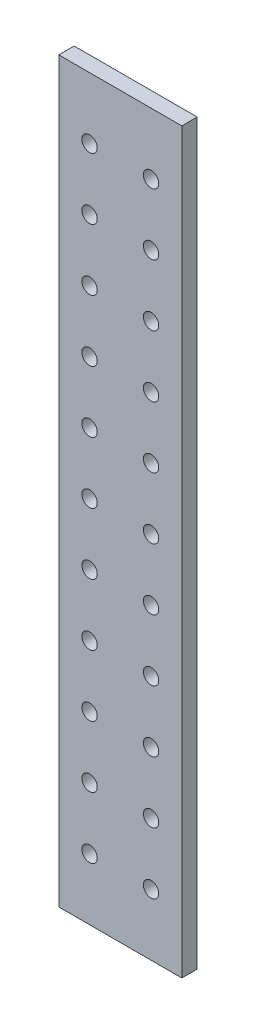
ISO-10303-21;
HEADER;
FILE_DESCRIPTION(('STEP AP214'),'2;1');
FILE_NAME('part.step','',(''),(''),'','','');
FILE_SCHEMA(('AUTOMOTIVE_DESIGN { 1 0 10303 214 1 1 1 1 }'));
ENDSEC;
DATA;
#1=APPLICATION_CONTEXT('core data for automotive mechanical design processes');
#2=APPLICATION_PROTOCOL_DEFINITION('international standard','automotive_design',2000,#1);
#3=PRODUCT_CONTEXT('',#1,'mechanical');
#4=PRODUCT('Part','Part','',(#3));
#5=PRODUCT_RELATED_PRODUCT_CATEGORY('part','',(#4));
#6=PRODUCT_DEFINITION_FORMATION('','',#4);
#7=PRODUCT_DEFINITION_CONTEXT('part definition',#1,'design');
#8=PRODUCT_DEFINITION('design','',#6,#7);
#9=PRODUCT_DEFINITION_SHAPE('','',#8);
#10=(LENGTH_UNIT() NAMED_UNIT(*) SI_UNIT(.MILLI.,.METRE.));
#11=(NAMED_UNIT(*) PLANE_ANGLE_UNIT() SI_UNIT($,.RADIAN.));
#12=(NAMED_UNIT(*) SI_UNIT($,.STERADIAN.) SOLID_ANGLE_UNIT());
#13=UNCERTAINTY_MEASURE_WITH_UNIT(LENGTH_MEASURE(1.E-05),#10,'distance_accuracy_value','');
#14=(GEOMETRIC_REPRESENTATION_CONTEXT(3) GLOBAL_UNCERTAINTY_ASSIGNED_CONTEXT((#13)) GLOBAL_UNIT_ASSIGNED_CONTEXT((#10,
#11,#12)) REPRESENTATION_CONTEXT('',''));
#15=CARTESIAN_POINT('',(0.,0.,0.));
#16=DIRECTION('',(0.,0.,1.));
#17=DIRECTION('',(1.,0.,0.));
#18=AXIS2_PLACEMENT_3D('',#15,#16,#17);
#19=CARTESIAN_POINT('',(25.4,152.4,3.175));
#20=DIRECTION('',(-1.,0.,0.));
#21=DIRECTION('',(0.,-1.,0.));
#22=AXIS2_PLACEMENT_3D('',#19,#20,#21);
#23=PLANE('',#22);
#24=DIRECTION('',(0.,1.,0.));
#25=VECTOR('',#24,1.);
#26=CARTESIAN_POINT('',(25.4,152.4,-3.175));
#27=LINE('',#26,#25);
#28=CARTESIAN_POINT('',(25.4,-152.4,-3.175));
#29=VERTEX_POINT('',#28);
#30=CARTESIAN_POINT('',(25.4,152.4,-3.175));
#31=VERTEX_POINT('',#30);
#32=EDGE_CURVE('E95',#29,#31,#27,.T.);
#33=ORIENTED_EDGE('',*,*,#32,.T.);
#34=DIRECTION('',(0.,0.,-1.));
#35=VECTOR('',#34,1.);
#36=CARTESIAN_POINT('',(25.4,152.4,3.175));
#37=LINE('',#36,#35);
#38=CARTESIAN_POINT('',(25.4,152.4,3.175));
#39=VERTEX_POINT('',#38);
#40=EDGE_CURVE('E11',#39,#31,#37,.T.);
#41=ORIENTED_EDGE('',*,*,#40,.F.);
#42=DIRECTION('',(0.,1.,0.));
#43=VECTOR('',#42,1.);
#44=CARTESIAN_POINT('',(25.4,152.4,3.175));
#45=LINE('',#44,#43);
#46=CARTESIAN_POINT('',(25.4,-152.4,3.175));
#47=VERTEX_POINT('',#46);
#48=EDGE_CURVE('E83',#47,#39,#45,.T.);
#49=ORIENTED_EDGE('',*,*,#48,.F.);
#50=DIRECTION('',(0.,0.,-1.));
#51=VECTOR('',#50,1.);
#52=CARTESIAN_POINT('',(25.4,-152.4,3.175));
#53=LINE('',#52,#51);
#54=EDGE_CURVE('E91',#47,#29,#53,.T.);
#55=ORIENTED_EDGE('',*,*,#54,.T.);
#56=EDGE_LOOP('',(#33,#41,#49,#55));
#57=FACE_BOUND('',#56,.T.);
#58=ADVANCED_FACE('F32',(#57),#23,.F.);
#59=CARTESIAN_POINT('',(-25.4,152.4,3.175));
#60=DIRECTION('',(0.,-1.,0.));
#61=DIRECTION('',(0.,0.,-1.));
#62=AXIS2_PLACEMENT_3D('',#59,#60,#61);
#63=PLANE('',#62);
#64=DIRECTION('',(-1.,0.,0.));
#65=VECTOR('',#64,1.);
#66=CARTESIAN_POINT('',(-25.4,152.4,-3.175));
#67=LINE('',#66,#65);
#68=CARTESIAN_POINT('',(-25.4,152.4,-3.175));
#69=VERTEX_POINT('',#68);
#70=EDGE_CURVE('E87',#31,#69,#67,.T.);
#71=ORIENTED_EDGE('',*,*,#70,.T.);
#72=DIRECTION('',(0.,0.,-1.));
#73=VECTOR('',#72,1.);
#74=CARTESIAN_POINT('',(-25.4,152.4,3.175));
#75=LINE('',#74,#73);
#76=CARTESIAN_POINT('',(-25.4,152.4,3.175));
#77=VERTEX_POINT('',#76);
#78=EDGE_CURVE('E40',#77,#69,#75,.T.);
#79=ORIENTED_EDGE('',*,*,#78,.F.);
#80=DIRECTION('',(-1.,0.,0.));
#81=VECTOR('',#80,1.);
#82=CARTESIAN_POINT('',(-25.4,152.4,3.175));
#83=LINE('',#82,#81);
#84=EDGE_CURVE('E78',#39,#77,#83,.T.);
#85=ORIENTED_EDGE('',*,*,#84,.F.);
#86=ORIENTED_EDGE('',*,*,#40,.T.);
#87=EDGE_LOOP('',(#71,#79,#85,#86));
#88=FACE_BOUND('',#87,.T.);
#89=ADVANCED_FACE('F86',(#88),#63,.F.);
#90=CARTESIAN_POINT('',(-25.4,152.4,3.175));
#91=DIRECTION('',(1.,0.,0.));
#92=DIRECTION('',(0.,1.,0.));
#93=AXIS2_PLACEMENT_3D('',#90,#91,#92);
#94=PLANE('',#93);
#95=DIRECTION('',(0.,-1.,0.));
#96=VECTOR('',#95,1.);
#97=CARTESIAN_POINT('',(-25.4,152.4,-3.175));
#98=LINE('',#97,#96);
#99=CARTESIAN_POINT('',(-25.4,-152.4,-3.175));
#100=VERTEX_POINT('',#99);
#101=EDGE_CURVE('E65',#69,#100,#98,.T.);
#102=ORIENTED_EDGE('',*,*,#101,.T.);
#103=DIRECTION('',(0.,0.,-1.));
#104=VECTOR('',#103,1.);
#105=CARTESIAN_POINT('',(-25.4,-152.4,3.175));
#106=LINE('',#105,#104);
#107=CARTESIAN_POINT('',(-25.4,-152.4,3.175));
#108=VERTEX_POINT('',#107);
#109=EDGE_CURVE('E88',#108,#100,#106,.T.);
#110=ORIENTED_EDGE('',*,*,#109,.F.);
#111=DIRECTION('',(0.,-1.,0.));
#112=VECTOR('',#111,1.);
#113=CARTESIAN_POINT('',(-25.4,152.4,3.175));
#114=LINE('',#113,#112);
#115=EDGE_CURVE('E81',#77,#108,#114,.T.);
#116=ORIENTED_EDGE('',*,*,#115,.F.);
#117=ORIENTED_EDGE('',*,*,#78,.T.);
#118=EDGE_LOOP('',(#102,#110,#116,#117));
#119=FACE_BOUND('',#118,.T.);
#120=ADVANCED_FACE('F89',(#119),#94,.F.);
#121=CARTESIAN_POINT('',(-25.4,-152.4,3.175));
#122=DIRECTION('',(0.,1.,0.));
#123=DIRECTION('',(0.,0.,1.));
#124=AXIS2_PLACEMENT_3D('',#121,#122,#123);
#125=PLANE('',#124);
#126=DIRECTION('',(1.,0.,0.));
#127=VECTOR('',#126,1.);
#128=CARTESIAN_POINT('',(-25.4,-152.4,-3.175));
#129=LINE('',#128,#127);
#130=EDGE_CURVE('E71',#100,#29,#129,.T.);
#131=ORIENTED_EDGE('',*,*,#130,.T.);
#132=ORIENTED_EDGE('',*,*,#54,.F.);
#133=DIRECTION('',(1.,0.,0.));
#134=VECTOR('',#133,1.);
#135=CARTESIAN_POINT('',(-25.4,-152.4,3.175));
#136=LINE('',#135,#134);
#137=EDGE_CURVE('E48',#108,#47,#136,.T.);
#138=ORIENTED_EDGE('',*,*,#137,.F.);
#139=ORIENTED_EDGE('',*,*,#109,.T.);
#140=EDGE_LOOP('',(#131,#132,#138,#139));
#141=FACE_BOUND('',#140,.T.);
#142=ADVANCED_FACE('F103',(#141),#125,.F.);
#143=CARTESIAN_POINT('',(0.,0.,3.175));
#144=DIRECTION('',(0.,0.,1.));
#145=DIRECTION('',(1.,0.,0.));
#146=AXIS2_PLACEMENT_3D('',#143,#144,#145);
#147=PLANE('',#146);
#148=CARTESIAN_POINT('',(-12.6999999999989,25.4000000000001,3.175));
#149=DIRECTION('',(0.,0.,1.));
#150=DIRECTION('',(1.,0.,0.));
#151=AXIS2_PLACEMENT_3D('',#148,#149,#150);
#152=CIRCLE('',#151,3.175);
#153=CARTESIAN_POINT('',(-9.52499999999894,25.4000000000001,3.175));
#154=VERTEX_POINT('',#153);
#155=EDGE_CURVE('E191',#154,#154,#152,.T.);
#156=ORIENTED_EDGE('',*,*,#155,.F.);
#157=EDGE_LOOP('',(#156));
#158=FACE_BOUND('',#157,.T.);
#159=CARTESIAN_POINT('',(-12.6999999999992,50.8000000000001,3.175));
#160=DIRECTION('',(0.,0.,1.));
#161=DIRECTION('',(1.,0.,0.));
#162=AXIS2_PLACEMENT_3D('',#159,#160,#161);
#163=CIRCLE('',#162,3.175);
#164=CARTESIAN_POINT('',(-9.52499999999922,50.8000000000001,3.175));
#165=VERTEX_POINT('',#164);
#166=EDGE_CURVE('E190',#165,#165,#163,.T.);
#167=ORIENTED_EDGE('',*,*,#166,.F.);
#168=EDGE_LOOP('',(#167));
#169=FACE_BOUND('',#168,.T.);
#170=CARTESIAN_POINT('',(-12.6999999999995,76.2000000000001,3.175));
#171=DIRECTION('',(0.,0.,1.));
#172=DIRECTION('',(1.,0.,0.));
#173=AXIS2_PLACEMENT_3D('',#170,#171,#172);
#174=CIRCLE('',#173,3.175);
#175=CARTESIAN_POINT('',(-9.52499999999949,76.2000000000001,3.175));
#176=VERTEX_POINT('',#175);
#177=EDGE_CURVE('E198',#176,#176,#174,.T.);
#178=ORIENTED_EDGE('',*,*,#177,.F.);
#179=EDGE_LOOP('',(#178));
#180=FACE_BOUND('',#179,.T.);
#181=CARTESIAN_POINT('',(-12.6999999999997,101.6,3.175));
#182=DIRECTION('',(0.,0.,1.));
#183=DIRECTION('',(1.,0.,0.));
#184=AXIS2_PLACEMENT_3D('',#181,#182,#183);
#185=CIRCLE('',#184,3.175);
#186=CARTESIAN_POINT('',(-9.52499999999975,101.6,3.175));
#187=VERTEX_POINT('',#186);
#188=EDGE_CURVE('E179',#187,#187,#185,.T.);
#189=ORIENTED_EDGE('',*,*,#188,.F.);
#190=EDGE_LOOP('',(#189));
#191=FACE_BOUND('',#190,.T.);
#192=CARTESIAN_POINT('',(12.7000000000024,-101.599999999999,3.175));
#193=DIRECTION('',(0.,0.,1.));
#194=DIRECTION('',(1.,0.,0.));
#195=AXIS2_PLACEMENT_3D('',#192,#193,#194);
#196=CIRCLE('',#195,3.175);
#197=CARTESIAN_POINT('',(15.8750000000024,-101.599999999999,3.175));
#198=VERTEX_POINT('',#197);
#199=EDGE_CURVE('E178',#198,#198,#196,.T.);
#200=ORIENTED_EDGE('',*,*,#199,.F.);
#201=EDGE_LOOP('',(#200));
#202=FACE_BOUND('',#201,.T.);
#203=CARTESIAN_POINT('',(-12.6999999999987,1.38777878078145E-13,3.175));
#204=DIRECTION('',(0.,0.,1.));
#205=DIRECTION('',(1.,0.,0.));
#206=AXIS2_PLACEMENT_3D('',#203,#204,#205);
#207=CIRCLE('',#206,3.17500000000001);
#208=CARTESIAN_POINT('',(-9.52499999999868,1.38777878078145E-13,3.175));
#209=VERTEX_POINT('',#208);
#210=EDGE_CURVE('E233',#209,#209,#207,.T.);
#211=ORIENTED_EDGE('',*,*,#210,.F.);
#212=EDGE_LOOP('',(#211));
#213=FACE_BOUND('',#212,.T.);
#214=CARTESIAN_POINT('',(-12.6999999999984,-25.3999999999998,3.175));
#215=DIRECTION('',(0.,0.,1.));
#216=DIRECTION('',(1.,0.,0.));
#217=AXIS2_PLACEMENT_3D('',#214,#215,#216);
#218=CIRCLE('',#217,3.175);
#219=CARTESIAN_POINT('',(-9.52499999999841,-25.3999999999998,3.175));
#220=VERTEX_POINT('',#219);
#221=EDGE_CURVE('E227',#220,#220,#218,.T.);
#222=ORIENTED_EDGE('',*,*,#221,.F.);
#223=EDGE_LOOP('',(#222));
#224=FACE_BOUND('',#223,.T.);
#225=CARTESIAN_POINT('',(-12.6999999999982,-50.7999999999998,3.175));
#226=DIRECTION('',(0.,0.,1.));
#227=DIRECTION('',(1.,0.,0.));
#228=AXIS2_PLACEMENT_3D('',#225,#226,#227);
#229=CIRCLE('',#228,3.175);
#230=CARTESIAN_POINT('',(-9.52499999999815,-50.7999999999998,3.175));
#231=VERTEX_POINT('',#230);
#232=EDGE_CURVE('E221',#231,#231,#229,.T.);
#233=ORIENTED_EDGE('',*,*,#232,.F.);
#234=EDGE_LOOP('',(#233));
#235=FACE_BOUND('',#234,.T.);
#236=CARTESIAN_POINT('',(-12.6999999999979,-76.1999999999998,3.175));
#237=DIRECTION('',(0.,0.,1.));
#238=DIRECTION('',(1.,0.,0.));
#239=AXIS2_PLACEMENT_3D('',#236,#237,#238);
#240=CIRCLE('',#239,3.175);
#241=CARTESIAN_POINT('',(-9.52499999999789,-76.1999999999998,3.175));
#242=VERTEX_POINT('',#241);
#243=EDGE_CURVE('E215',#242,#242,#240,.T.);
#244=ORIENTED_EDGE('',*,*,#243,.F.);
#245=EDGE_LOOP('',(#244));
#246=FACE_BOUND('',#245,.T.);
#247=CARTESIAN_POINT('',(-12.6999999999976,-101.6,3.175));
#248=DIRECTION('',(0.,0.,1.));
#249=DIRECTION('',(1.,0.,0.));
#250=AXIS2_PLACEMENT_3D('',#247,#248,#249);
#251=CIRCLE('',#250,3.175);
#252=CARTESIAN_POINT('',(-9.52499999999762,-101.6,3.175));
#253=VERTEX_POINT('',#252);
#254=EDGE_CURVE('E208',#253,#253,#251,.T.);
#255=ORIENTED_EDGE('',*,*,#254,.F.);
#256=EDGE_LOOP('',(#255));
#257=FACE_BOUND('',#256,.T.);
#258=CARTESIAN_POINT('',(12.7000000000026,-126.999999999999,3.175));
#259=DIRECTION('',(0.,0.,1.));
#260=DIRECTION('',(1.,0.,0.));
#261=AXIS2_PLACEMENT_3D('',#258,#259,#260);
#262=CIRCLE('',#261,3.175);
#263=CARTESIAN_POINT('',(15.8750000000026,-126.999999999999,3.175));
#264=VERTEX_POINT('',#263);
#265=EDGE_CURVE('E209',#264,#264,#262,.T.);
#266=ORIENTED_EDGE('',*,*,#265,.F.);
#267=EDGE_LOOP('',(#266));
#268=FACE_BOUND('',#267,.T.);
#269=CARTESIAN_POINT('',(12.7000000000008,50.8000000000005,3.175));
#270=DIRECTION('',(0.,0.,1.));
#271=DIRECTION('',(1.,0.,0.));
#272=AXIS2_PLACEMENT_3D('',#269,#270,#271);
#273=CIRCLE('',#272,3.175);
#274=CARTESIAN_POINT('',(15.8750000000008,50.8000000000005,3.175));
#275=VERTEX_POINT('',#274);
#276=EDGE_CURVE('E131',#275,#275,#273,.T.);
#277=ORIENTED_EDGE('',*,*,#276,.F.);
#278=EDGE_LOOP('',(#277));
#279=FACE_BOUND('',#278,.T.);
#280=CARTESIAN_POINT('',(12.7000000000005,76.2000000000004,3.175));
#281=DIRECTION('',(0.,0.,1.));
#282=DIRECTION('',(1.,0.,0.));
#283=AXIS2_PLACEMENT_3D('',#280,#281,#282);
#284=CIRCLE('',#283,3.175);
#285=CARTESIAN_POINT('',(15.8750000000005,76.2000000000004,3.175));
#286=VERTEX_POINT('',#285);
#287=EDGE_CURVE('E130',#286,#286,#284,.T.);
#288=ORIENTED_EDGE('',*,*,#287,.F.);
#289=EDGE_LOOP('',(#288));
#290=FACE_BOUND('',#289,.T.);
#291=CARTESIAN_POINT('',(12.7000000000003,101.6,3.175));
#292=DIRECTION('',(0.,0.,1.));
#293=DIRECTION('',(1.,0.,0.));
#294=AXIS2_PLACEMENT_3D('',#291,#292,#293);
#295=CIRCLE('',#294,3.175);
#296=CARTESIAN_POINT('',(15.8750000000003,101.6,3.175));
#297=VERTEX_POINT('',#296);
#298=EDGE_CURVE('E138',#297,#297,#295,.T.);
#299=ORIENTED_EDGE('',*,*,#298,.F.);
#300=EDGE_LOOP('',(#299));
#301=FACE_BOUND('',#300,.T.);
#302=CARTESIAN_POINT('',(12.7,127.,3.175));
#303=DIRECTION('',(0.,0.,1.));
#304=DIRECTION('',(1.,0.,0.));
#305=AXIS2_PLACEMENT_3D('',#302,#303,#304);
#306=CIRCLE('',#305,3.175);
#307=CARTESIAN_POINT('',(15.875,127.,3.175));
#308=VERTEX_POINT('',#307);
#309=EDGE_CURVE('E119',#308,#308,#306,.T.);
#310=ORIENTED_EDGE('',*,*,#309,.F.);
#311=EDGE_LOOP('',(#310));
#312=FACE_BOUND('',#311,.T.);
#313=CARTESIAN_POINT('',(-12.6999999999974,-127.,3.175));
#314=DIRECTION('',(0.,0.,1.));
#315=DIRECTION('',(1.,0.,0.));
#316=AXIS2_PLACEMENT_3D('',#313,#314,#315);
#317=CIRCLE('',#316,3.175);
#318=CARTESIAN_POINT('',(-9.52499999999736,-127.,3.175));
#319=VERTEX_POINT('',#318);
#320=EDGE_CURVE('E118',#319,#319,#317,.T.);
#321=ORIENTED_EDGE('',*,*,#320,.F.);
#322=EDGE_LOOP('',(#321));
#323=FACE_BOUND('',#322,.T.);
#324=CARTESIAN_POINT('',(12.7000000000011,25.4000000000005,3.175));
#325=DIRECTION('',(0.,0.,1.));
#326=DIRECTION('',(1.,0.,0.));
#327=AXIS2_PLACEMENT_3D('',#324,#325,#326);
#328=CIRCLE('',#327,3.175);
#329=CARTESIAN_POINT('',(15.8750000000011,25.4000000000005,3.175));
#330=VERTEX_POINT('',#329);
#331=EDGE_CURVE('E168',#330,#330,#328,.T.);
#332=ORIENTED_EDGE('',*,*,#331,.F.);
#333=EDGE_LOOP('',(#332));
#334=FACE_BOUND('',#333,.T.);
#335=CARTESIAN_POINT('',(12.7000000000013,4.9960036108132E-13,3.175));
#336=DIRECTION('',(0.,0.,1.));
#337=DIRECTION('',(1.,0.,0.));
#338=AXIS2_PLACEMENT_3D('',#335,#336,#337);
#339=CIRCLE('',#338,3.175);
#340=CARTESIAN_POINT('',(15.8750000000013,4.9960036108132E-13,3.175));
#341=VERTEX_POINT('',#340);
#342=EDGE_CURVE('E162',#341,#341,#339,.T.);
#343=ORIENTED_EDGE('',*,*,#342,.F.);
#344=EDGE_LOOP('',(#343));
#345=FACE_BOUND('',#344,.T.);
#346=CARTESIAN_POINT('',(12.7000000000016,-25.3999999999995,3.175));
#347=DIRECTION('',(0.,0.,1.));
#348=DIRECTION('',(1.,0.,0.));
#349=AXIS2_PLACEMENT_3D('',#346,#347,#348);
#350=CIRCLE('',#349,3.175);
#351=CARTESIAN_POINT('',(15.8750000000016,-25.3999999999995,3.175));
#352=VERTEX_POINT('',#351);
#353=EDGE_CURVE('E156',#352,#352,#350,.T.);
#354=ORIENTED_EDGE('',*,*,#353,.F.);
#355=EDGE_LOOP('',(#354));
#356=FACE_BOUND('',#355,.T.);
#357=CARTESIAN_POINT('',(12.7000000000018,-50.7999999999995,3.175));
#358=DIRECTION('',(0.,0.,1.));
#359=DIRECTION('',(1.,0.,0.));
#360=AXIS2_PLACEMENT_3D('',#357,#358,#359);
#361=CIRCLE('',#360,3.175);
#362=CARTESIAN_POINT('',(15.8750000000018,-50.7999999999995,3.175));
#363=VERTEX_POINT('',#362);
#364=EDGE_CURVE('E148',#363,#363,#361,.T.);
#365=ORIENTED_EDGE('',*,*,#364,.F.);
#366=EDGE_LOOP('',(#365));
#367=FACE_BOUND('',#366,.T.);
#368=CARTESIAN_POINT('',(12.7000000000021,-76.1999999999994,3.175));
#369=DIRECTION('',(0.,0.,1.));
#370=DIRECTION('',(1.,0.,0.));
#371=AXIS2_PLACEMENT_3D('',#368,#369,#370);
#372=CIRCLE('',#371,3.175);
#373=CARTESIAN_POINT('',(15.8750000000021,-76.1999999999994,3.175));
#374=VERTEX_POINT('',#373);
#375=EDGE_CURVE('E149',#374,#374,#372,.T.);
#376=ORIENTED_EDGE('',*,*,#375,.F.);
#377=EDGE_LOOP('',(#376));
#378=FACE_BOUND('',#377,.T.);
#379=CARTESIAN_POINT('',(-12.7,127.,3.175));
#380=DIRECTION('',(0.,0.,1.));
#381=DIRECTION('',(1.,0.,0.));
#382=AXIS2_PLACEMENT_3D('',#379,#380,#381);
#383=CIRCLE('',#382,3.175);
#384=CARTESIAN_POINT('',(-9.52500000000002,127.,3.175));
#385=VERTEX_POINT('',#384);
#386=EDGE_CURVE('E111',#385,#385,#383,.T.);
#387=ORIENTED_EDGE('',*,*,#386,.F.);
#388=EDGE_LOOP('',(#387));
#389=FACE_BOUND('',#388,.T.);
#390=ORIENTED_EDGE('',*,*,#48,.T.);
#391=ORIENTED_EDGE('',*,*,#84,.T.);
#392=ORIENTED_EDGE('',*,*,#115,.T.);
#393=ORIENTED_EDGE('',*,*,#137,.T.);
#394=EDGE_LOOP('',(#390,#391,#392,#393));
#395=FACE_BOUND('',#394,.T.);
#396=ADVANCED_FACE('F79',(#158,#169,#180,#191,#202,#213,#224,#235,#246,#257,#268,#279,#290,#301,
#312,#323,#334,#345,#356,#367,#378,#389,#395),#147,.T.);
#397=CARTESIAN_POINT('',(0.,0.,-3.175));
#398=DIRECTION('',(0.,0.,1.));
#399=DIRECTION('',(1.,0.,0.));
#400=AXIS2_PLACEMENT_3D('',#397,#398,#399);
#401=PLANE('',#400);
#402=CARTESIAN_POINT('',(-12.6999999999989,25.4000000000001,-3.175));
#403=DIRECTION('',(0.,0.,1.));
#404=DIRECTION('',(1.,0.,0.));
#405=AXIS2_PLACEMENT_3D('',#402,#403,#404);
#406=CIRCLE('',#405,3.175);
#407=CARTESIAN_POINT('',(-9.52499999999894,25.4000000000001,-3.175));
#408=VERTEX_POINT('',#407);
#409=EDGE_CURVE('E187',#408,#408,#406,.T.);
#410=ORIENTED_EDGE('',*,*,#409,.T.);
#411=EDGE_LOOP('',(#410));
#412=FACE_BOUND('',#411,.T.);
#413=CARTESIAN_POINT('',(-12.6999999999992,50.8000000000001,-3.175));
#414=DIRECTION('',(0.,0.,1.));
#415=DIRECTION('',(1.,0.,0.));
#416=AXIS2_PLACEMENT_3D('',#413,#414,#415);
#417=CIRCLE('',#416,3.175);
#418=CARTESIAN_POINT('',(-9.52499999999922,50.8000000000001,-3.175));
#419=VERTEX_POINT('',#418);
#420=EDGE_CURVE('E195',#419,#419,#417,.T.);
#421=ORIENTED_EDGE('',*,*,#420,.T.);
#422=EDGE_LOOP('',(#421));
#423=FACE_BOUND('',#422,.T.);
#424=CARTESIAN_POINT('',(-12.6999999999995,76.2000000000001,-3.175));
#425=DIRECTION('',(0.,0.,1.));
#426=DIRECTION('',(1.,0.,0.));
#427=AXIS2_PLACEMENT_3D('',#424,#425,#426);
#428=CIRCLE('',#427,3.175);
#429=CARTESIAN_POINT('',(-9.52499999999949,76.2000000000001,-3.175));
#430=VERTEX_POINT('',#429);
#431=EDGE_CURVE('E182',#430,#430,#428,.T.);
#432=ORIENTED_EDGE('',*,*,#431,.T.);
#433=EDGE_LOOP('',(#432));
#434=FACE_BOUND('',#433,.T.);
#435=CARTESIAN_POINT('',(-12.6999999999997,101.6,-3.175));
#436=DIRECTION('',(0.,0.,1.));
#437=DIRECTION('',(1.,0.,0.));
#438=AXIS2_PLACEMENT_3D('',#435,#436,#437);
#439=CIRCLE('',#438,3.175);
#440=CARTESIAN_POINT('',(-9.52499999999975,101.6,-3.175));
#441=VERTEX_POINT('',#440);
#442=EDGE_CURVE('E175',#441,#441,#439,.T.);
#443=ORIENTED_EDGE('',*,*,#442,.T.);
#444=EDGE_LOOP('',(#443));
#445=FACE_BOUND('',#444,.T.);
#446=CARTESIAN_POINT('',(12.7000000000024,-101.599999999999,-3.175));
#447=DIRECTION('',(0.,0.,1.));
#448=DIRECTION('',(1.,0.,0.));
#449=AXIS2_PLACEMENT_3D('',#446,#447,#448);
#450=CIRCLE('',#449,3.175);
#451=CARTESIAN_POINT('',(15.8750000000024,-101.599999999999,-3.175));
#452=VERTEX_POINT('',#451);
#453=EDGE_CURVE('E152',#452,#452,#450,.T.);
#454=ORIENTED_EDGE('',*,*,#453,.T.);
#455=EDGE_LOOP('',(#454));
#456=FACE_BOUND('',#455,.T.);
#457=CARTESIAN_POINT('',(-12.6999999999987,1.38777878078145E-13,-3.175));
#458=DIRECTION('',(0.,0.,1.));
#459=DIRECTION('',(1.,0.,0.));
#460=AXIS2_PLACEMENT_3D('',#457,#458,#459);
#461=CIRCLE('',#460,3.17500000000001);
#462=CARTESIAN_POINT('',(-9.52499999999868,1.38777878078145E-13,-3.175));
#463=VERTEX_POINT('',#462);
#464=EDGE_CURVE('E194',#463,#463,#461,.T.);
#465=ORIENTED_EDGE('',*,*,#464,.T.);
#466=EDGE_LOOP('',(#465));
#467=FACE_BOUND('',#466,.T.);
#468=CARTESIAN_POINT('',(-12.6999999999984,-25.3999999999998,-3.175));
#469=DIRECTION('',(0.,0.,1.));
#470=DIRECTION('',(1.,0.,0.));
#471=AXIS2_PLACEMENT_3D('',#468,#469,#470);
#472=CIRCLE('',#471,3.175);
#473=CARTESIAN_POINT('',(-9.52499999999841,-25.3999999999998,-3.175));
#474=VERTEX_POINT('',#473);
#475=EDGE_CURVE('E230',#474,#474,#472,.T.);
#476=ORIENTED_EDGE('',*,*,#475,.T.);
#477=EDGE_LOOP('',(#476));
#478=FACE_BOUND('',#477,.T.);
#479=CARTESIAN_POINT('',(-12.6999999999982,-50.7999999999998,-3.175));
#480=DIRECTION('',(0.,0.,1.));
#481=DIRECTION('',(1.,0.,0.));
#482=AXIS2_PLACEMENT_3D('',#479,#480,#481);
#483=CIRCLE('',#482,3.175);
#484=CARTESIAN_POINT('',(-9.52499999999815,-50.7999999999998,-3.175));
#485=VERTEX_POINT('',#484);
#486=EDGE_CURVE('E224',#485,#485,#483,.T.);
#487=ORIENTED_EDGE('',*,*,#486,.T.);
#488=EDGE_LOOP('',(#487));
#489=FACE_BOUND('',#488,.T.);
#490=CARTESIAN_POINT('',(-12.6999999999979,-76.1999999999998,-3.175));
#491=DIRECTION('',(0.,0.,1.));
#492=DIRECTION('',(1.,0.,0.));
#493=AXIS2_PLACEMENT_3D('',#490,#491,#492);
#494=CIRCLE('',#493,3.175);
#495=CARTESIAN_POINT('',(-9.52499999999789,-76.1999999999998,-3.175));
#496=VERTEX_POINT('',#495);
#497=EDGE_CURVE('E218',#496,#496,#494,.T.);
#498=ORIENTED_EDGE('',*,*,#497,.T.);
#499=EDGE_LOOP('',(#498));
#500=FACE_BOUND('',#499,.T.);
#501=CARTESIAN_POINT('',(-12.6999999999976,-101.6,-3.175));
#502=DIRECTION('',(0.,0.,1.));
#503=DIRECTION('',(1.,0.,0.));
#504=AXIS2_PLACEMENT_3D('',#501,#502,#503);
#505=CIRCLE('',#504,3.175);
#506=CARTESIAN_POINT('',(-9.52499999999762,-101.6,-3.175));
#507=VERTEX_POINT('',#506);
#508=EDGE_CURVE('E212',#507,#507,#505,.T.);
#509=ORIENTED_EDGE('',*,*,#508,.T.);
#510=EDGE_LOOP('',(#509));
#511=FACE_BOUND('',#510,.T.);
#512=CARTESIAN_POINT('',(12.7000000000026,-126.999999999999,-3.175));
#513=DIRECTION('',(0.,0.,1.));
#514=DIRECTION('',(1.,0.,0.));
#515=AXIS2_PLACEMENT_3D('',#512,#513,#514);
#516=CIRCLE('',#515,3.175);
#517=CARTESIAN_POINT('',(15.8750000000026,-126.999999999999,-3.175));
#518=VERTEX_POINT('',#517);
#519=EDGE_CURVE('E205',#518,#518,#516,.T.);
#520=ORIENTED_EDGE('',*,*,#519,.T.);
#521=EDGE_LOOP('',(#520));
#522=FACE_BOUND('',#521,.T.);
#523=CARTESIAN_POINT('',(12.7000000000008,50.8000000000005,-3.175));
#524=DIRECTION('',(0.,0.,1.));
#525=DIRECTION('',(1.,0.,0.));
#526=AXIS2_PLACEMENT_3D('',#523,#524,#525);
#527=CIRCLE('',#526,3.175);
#528=CARTESIAN_POINT('',(15.8750000000008,50.8000000000005,-3.175));
#529=VERTEX_POINT('',#528);
#530=EDGE_CURVE('E127',#529,#529,#527,.T.);
#531=ORIENTED_EDGE('',*,*,#530,.T.);
#532=EDGE_LOOP('',(#531));
#533=FACE_BOUND('',#532,.T.);
#534=CARTESIAN_POINT('',(12.7000000000005,76.2000000000004,-3.175));
#535=DIRECTION('',(0.,0.,1.));
#536=DIRECTION('',(1.,0.,0.));
#537=AXIS2_PLACEMENT_3D('',#534,#535,#536);
#538=CIRCLE('',#537,3.175);
#539=CARTESIAN_POINT('',(15.8750000000005,76.2000000000004,-3.175));
#540=VERTEX_POINT('',#539);
#541=EDGE_CURVE('E135',#540,#540,#538,.T.);
#542=ORIENTED_EDGE('',*,*,#541,.T.);
#543=EDGE_LOOP('',(#542));
#544=FACE_BOUND('',#543,.T.);
#545=CARTESIAN_POINT('',(12.7000000000003,101.6,-3.175));
#546=DIRECTION('',(0.,0.,1.));
#547=DIRECTION('',(1.,0.,0.));
#548=AXIS2_PLACEMENT_3D('',#545,#546,#547);
#549=CIRCLE('',#548,3.175);
#550=CARTESIAN_POINT('',(15.8750000000003,101.6,-3.175));
#551=VERTEX_POINT('',#550);
#552=EDGE_CURVE('E122',#551,#551,#549,.T.);
#553=ORIENTED_EDGE('',*,*,#552,.T.);
#554=EDGE_LOOP('',(#553));
#555=FACE_BOUND('',#554,.T.);
#556=CARTESIAN_POINT('',(12.7,127.,-3.175));
#557=DIRECTION('',(0.,0.,1.));
#558=DIRECTION('',(1.,0.,0.));
#559=AXIS2_PLACEMENT_3D('',#556,#557,#558);
#560=CIRCLE('',#559,3.175);
#561=CARTESIAN_POINT('',(15.875,127.,-3.175));
#562=VERTEX_POINT('',#561);
#563=EDGE_CURVE('E115',#562,#562,#560,.T.);
#564=ORIENTED_EDGE('',*,*,#563,.T.);
#565=EDGE_LOOP('',(#564));
#566=FACE_BOUND('',#565,.T.);
#567=CARTESIAN_POINT('',(-12.6999999999974,-127.,-3.175));
#568=DIRECTION('',(0.,0.,1.));
#569=DIRECTION('',(1.,0.,0.));
#570=AXIS2_PLACEMENT_3D('',#567,#568,#569);
#571=CIRCLE('',#570,3.175);
#572=CARTESIAN_POINT('',(-9.52499999999736,-127.,-3.175));
#573=VERTEX_POINT('',#572);
#574=EDGE_CURVE('E114',#573,#573,#571,.T.);
#575=ORIENTED_EDGE('',*,*,#574,.T.);
#576=EDGE_LOOP('',(#575));
#577=FACE_BOUND('',#576,.T.);
#578=CARTESIAN_POINT('',(12.7000000000011,25.4000000000005,-3.175));
#579=DIRECTION('',(0.,0.,1.));
#580=DIRECTION('',(1.,0.,0.));
#581=AXIS2_PLACEMENT_3D('',#578,#579,#580);
#582=CIRCLE('',#581,3.175);
#583=CARTESIAN_POINT('',(15.8750000000011,25.4000000000005,-3.175));
#584=VERTEX_POINT('',#583);
#585=EDGE_CURVE('E134',#584,#584,#582,.T.);
#586=ORIENTED_EDGE('',*,*,#585,.T.);
#587=EDGE_LOOP('',(#586));
#588=FACE_BOUND('',#587,.T.);
#589=CARTESIAN_POINT('',(12.7000000000013,4.9960036108132E-13,-3.175));
#590=DIRECTION('',(0.,0.,1.));
#591=DIRECTION('',(1.,0.,0.));
#592=AXIS2_PLACEMENT_3D('',#589,#590,#591);
#593=CIRCLE('',#592,3.175);
#594=CARTESIAN_POINT('',(15.8750000000013,4.9960036108132E-13,-3.175));
#595=VERTEX_POINT('',#594);
#596=EDGE_CURVE('E165',#595,#595,#593,.T.);
#597=ORIENTED_EDGE('',*,*,#596,.T.);
#598=EDGE_LOOP('',(#597));
#599=FACE_BOUND('',#598,.T.);
#600=CARTESIAN_POINT('',(12.7000000000016,-25.3999999999995,-3.175));
#601=DIRECTION('',(0.,0.,1.));
#602=DIRECTION('',(1.,0.,0.));
#603=AXIS2_PLACEMENT_3D('',#600,#601,#602);
#604=CIRCLE('',#603,3.175);
#605=CARTESIAN_POINT('',(15.8750000000016,-25.3999999999995,-3.175));
#606=VERTEX_POINT('',#605);
#607=EDGE_CURVE('E159',#606,#606,#604,.T.);
#608=ORIENTED_EDGE('',*,*,#607,.T.);
#609=EDGE_LOOP('',(#608));
#610=FACE_BOUND('',#609,.T.);
#611=CARTESIAN_POINT('',(12.7000000000018,-50.7999999999995,-3.175));
#612=DIRECTION('',(0.,0.,1.));
#613=DIRECTION('',(1.,0.,0.));
#614=AXIS2_PLACEMENT_3D('',#611,#612,#613);
#615=CIRCLE('',#614,3.175);
#616=CARTESIAN_POINT('',(15.8750000000018,-50.7999999999995,-3.175));
#617=VERTEX_POINT('',#616);
#618=EDGE_CURVE('E153',#617,#617,#615,.T.);
#619=ORIENTED_EDGE('',*,*,#618,.T.);
#620=EDGE_LOOP('',(#619));
#621=FACE_BOUND('',#620,.T.);
#622=CARTESIAN_POINT('',(12.7000000000021,-76.1999999999994,-3.175));
#623=DIRECTION('',(0.,0.,1.));
#624=DIRECTION('',(1.,0.,0.));
#625=AXIS2_PLACEMENT_3D('',#622,#623,#624);
#626=CIRCLE('',#625,3.175);
#627=CARTESIAN_POINT('',(15.8750000000021,-76.1999999999994,-3.175));
#628=VERTEX_POINT('',#627);
#629=EDGE_CURVE('E145',#628,#628,#626,.T.);
#630=ORIENTED_EDGE('',*,*,#629,.T.);
#631=EDGE_LOOP('',(#630));
#632=FACE_BOUND('',#631,.T.);
#633=CARTESIAN_POINT('',(-12.7,127.,-3.175));
#634=DIRECTION('',(0.,0.,1.));
#635=DIRECTION('',(1.,0.,0.));
#636=AXIS2_PLACEMENT_3D('',#633,#634,#635);
#637=CIRCLE('',#636,3.175);
#638=CARTESIAN_POINT('',(-9.52500000000002,127.,-3.175));
#639=VERTEX_POINT('',#638);
#640=EDGE_CURVE('E98',#639,#639,#637,.T.);
#641=ORIENTED_EDGE('',*,*,#640,.T.);
#642=EDGE_LOOP('',(#641));
#643=FACE_BOUND('',#642,.T.);
#644=ORIENTED_EDGE('',*,*,#32,.F.);
#645=ORIENTED_EDGE('',*,*,#130,.F.);
#646=ORIENTED_EDGE('',*,*,#101,.F.);
#647=ORIENTED_EDGE('',*,*,#70,.F.);
#648=EDGE_LOOP('',(#644,#645,#646,#647));
#649=FACE_BOUND('',#648,.T.);
#650=ADVANCED_FACE('F106',(#412,#423,#434,#445,#456,#467,#478,#489,#500,#511,#522,#533,#544,
#555,#566,#577,#588,#599,#610,#621,#632,#643,#649),#401,.F.);
#651=CARTESIAN_POINT('',(-12.7,127.,-3.175));
#652=DIRECTION('',(0.,0.,1.));
#653=DIRECTION('',(1.,0.,0.));
#654=AXIS2_PLACEMENT_3D('',#651,#652,#653);
#655=CYLINDRICAL_SURFACE('',#654,3.175);
#656=ORIENTED_EDGE('',*,*,#640,.F.);
#657=EDGE_LOOP('',(#656));
#658=FACE_BOUND('',#657,.T.);
#659=ORIENTED_EDGE('',*,*,#386,.T.);
#660=EDGE_LOOP('',(#659));
#661=FACE_BOUND('',#660,.T.);
#662=ADVANCED_FACE('F279',(#658,#661),#655,.F.);
#663=CARTESIAN_POINT('',(12.7000000000021,-76.1999999999994,-3.175));
#664=DIRECTION('',(0.,0.,1.));
#665=DIRECTION('',(1.,0.,0.));
#666=AXIS2_PLACEMENT_3D('',#663,#664,#665);
#667=CYLINDRICAL_SURFACE('',#666,3.175);
#668=ORIENTED_EDGE('',*,*,#629,.F.);
#669=EDGE_LOOP('',(#668));
#670=FACE_BOUND('',#669,.T.);
#671=ORIENTED_EDGE('',*,*,#375,.T.);
#672=EDGE_LOOP('',(#671));
#673=FACE_BOUND('',#672,.T.);
#674=ADVANCED_FACE('F281',(#670,#673),#667,.F.);
#675=CARTESIAN_POINT('',(12.7000000000018,-50.7999999999995,-3.175));
#676=DIRECTION('',(0.,0.,1.));
#677=DIRECTION('',(1.,0.,0.));
#678=AXIS2_PLACEMENT_3D('',#675,#676,#677);
#679=CYLINDRICAL_SURFACE('',#678,3.175);
#680=ORIENTED_EDGE('',*,*,#618,.F.);
#681=EDGE_LOOP('',(#680));
#682=FACE_BOUND('',#681,.T.);
#683=ORIENTED_EDGE('',*,*,#364,.T.);
#684=EDGE_LOOP('',(#683));
#685=FACE_BOUND('',#684,.T.);
#686=ADVANCED_FACE('F288',(#682,#685),#679,.F.);
#687=CARTESIAN_POINT('',(12.7000000000016,-25.3999999999995,-3.175));
#688=DIRECTION('',(0.,0.,1.));
#689=DIRECTION('',(1.,0.,0.));
#690=AXIS2_PLACEMENT_3D('',#687,#688,#689);
#691=CYLINDRICAL_SURFACE('',#690,3.175);
#692=ORIENTED_EDGE('',*,*,#607,.F.);
#693=EDGE_LOOP('',(#692));
#694=FACE_BOUND('',#693,.T.);
#695=ORIENTED_EDGE('',*,*,#353,.T.);
#696=EDGE_LOOP('',(#695));
#697=FACE_BOUND('',#696,.T.);
#698=ADVANCED_FACE('F336',(#694,#697),#691,.F.);
#699=CARTESIAN_POINT('',(12.7000000000013,4.9960036108132E-13,-3.175));
#700=DIRECTION('',(0.,0.,1.));
#701=DIRECTION('',(1.,0.,0.));
#702=AXIS2_PLACEMENT_3D('',#699,#700,#701);
#703=CYLINDRICAL_SURFACE('',#702,3.175);
#704=ORIENTED_EDGE('',*,*,#596,.F.);
#705=EDGE_LOOP('',(#704));
#706=FACE_BOUND('',#705,.T.);
#707=ORIENTED_EDGE('',*,*,#342,.T.);
#708=EDGE_LOOP('',(#707));
#709=FACE_BOUND('',#708,.T.);
#710=ADVANCED_FACE('F346',(#706,#709),#703,.F.);
#711=CARTESIAN_POINT('',(12.7000000000011,25.4000000000005,-3.175));
#712=DIRECTION('',(0.,0.,1.));
#713=DIRECTION('',(1.,0.,0.));
#714=AXIS2_PLACEMENT_3D('',#711,#712,#713);
#715=CYLINDRICAL_SURFACE('',#714,3.175);
#716=ORIENTED_EDGE('',*,*,#585,.F.);
#717=EDGE_LOOP('',(#716));
#718=FACE_BOUND('',#717,.T.);
#719=ORIENTED_EDGE('',*,*,#331,.T.);
#720=EDGE_LOOP('',(#719));
#721=FACE_BOUND('',#720,.T.);
#722=ADVANCED_FACE('F356',(#718,#721),#715,.F.);
#723=CARTESIAN_POINT('',(-12.6999999999974,-127.,-3.175));
#724=DIRECTION('',(0.,0.,1.));
#725=DIRECTION('',(1.,0.,0.));
#726=AXIS2_PLACEMENT_3D('',#723,#724,#725);
#727=CYLINDRICAL_SURFACE('',#726,3.175);
#728=ORIENTED_EDGE('',*,*,#574,.F.);
#729=EDGE_LOOP('',(#728));
#730=FACE_BOUND('',#729,.T.);
#731=ORIENTED_EDGE('',*,*,#320,.T.);
#732=EDGE_LOOP('',(#731));
#733=FACE_BOUND('',#732,.T.);
#734=ADVANCED_FACE('F366',(#730,#733),#727,.F.);
#735=CARTESIAN_POINT('',(12.7,127.,-3.175));
#736=DIRECTION('',(0.,0.,1.));
#737=DIRECTION('',(1.,0.,0.));
#738=AXIS2_PLACEMENT_3D('',#735,#736,#737);
#739=CYLINDRICAL_SURFACE('',#738,3.175);
#740=ORIENTED_EDGE('',*,*,#563,.F.);
#741=EDGE_LOOP('',(#740));
#742=FACE_BOUND('',#741,.T.);
#743=ORIENTED_EDGE('',*,*,#309,.T.);
#744=EDGE_LOOP('',(#743));
#745=FACE_BOUND('',#744,.T.);
#746=ADVANCED_FACE('F376',(#742,#745),#739,.F.);
#747=CARTESIAN_POINT('',(12.7000000000003,101.6,-3.175));
#748=DIRECTION('',(0.,0.,1.));
#749=DIRECTION('',(1.,0.,0.));
#750=AXIS2_PLACEMENT_3D('',#747,#748,#749);
#751=CYLINDRICAL_SURFACE('',#750,3.175);
#752=ORIENTED_EDGE('',*,*,#552,.F.);
#753=EDGE_LOOP('',(#752));
#754=FACE_BOUND('',#753,.T.);
#755=ORIENTED_EDGE('',*,*,#298,.T.);
#756=EDGE_LOOP('',(#755));
#757=FACE_BOUND('',#756,.T.);
#758=ADVANCED_FACE('F386',(#754,#757),#751,.F.);
#759=CARTESIAN_POINT('',(12.7000000000005,76.2000000000004,-3.175));
#760=DIRECTION('',(0.,0.,1.));
#761=DIRECTION('',(1.,0.,0.));
#762=AXIS2_PLACEMENT_3D('',#759,#760,#761);
#763=CYLINDRICAL_SURFACE('',#762,3.175);
#764=ORIENTED_EDGE('',*,*,#541,.F.);
#765=EDGE_LOOP('',(#764));
#766=FACE_BOUND('',#765,.T.);
#767=ORIENTED_EDGE('',*,*,#287,.T.);
#768=EDGE_LOOP('',(#767));
#769=FACE_BOUND('',#768,.T.);
#770=ADVANCED_FACE('F395',(#766,#769),#763,.F.);
#771=CARTESIAN_POINT('',(12.7000000000008,50.8000000000005,-3.175));
#772=DIRECTION('',(0.,0.,1.));
#773=DIRECTION('',(1.,0.,0.));
#774=AXIS2_PLACEMENT_3D('',#771,#772,#773);
#775=CYLINDRICAL_SURFACE('',#774,3.175);
#776=ORIENTED_EDGE('',*,*,#530,.F.);
#777=EDGE_LOOP('',(#776));
#778=FACE_BOUND('',#777,.T.);
#779=ORIENTED_EDGE('',*,*,#276,.T.);
#780=EDGE_LOOP('',(#779));
#781=FACE_BOUND('',#780,.T.);
#782=ADVANCED_FACE('F405',(#778,#781),#775,.F.);
#783=CARTESIAN_POINT('',(12.7000000000026,-126.999999999999,-3.175));
#784=DIRECTION('',(0.,0.,1.));
#785=DIRECTION('',(1.,0.,0.));
#786=AXIS2_PLACEMENT_3D('',#783,#784,#785);
#787=CYLINDRICAL_SURFACE('',#786,3.175);
#788=ORIENTED_EDGE('',*,*,#519,.F.);
#789=EDGE_LOOP('',(#788));
#790=FACE_BOUND('',#789,.T.);
#791=ORIENTED_EDGE('',*,*,#265,.T.);
#792=EDGE_LOOP('',(#791));
#793=FACE_BOUND('',#792,.T.);
#794=ADVANCED_FACE('F415',(#790,#793),#787,.F.);
#795=CARTESIAN_POINT('',(-12.6999999999976,-101.6,-3.175));
#796=DIRECTION('',(0.,0.,1.));
#797=DIRECTION('',(1.,0.,0.));
#798=AXIS2_PLACEMENT_3D('',#795,#796,#797);
#799=CYLINDRICAL_SURFACE('',#798,3.175);
#800=ORIENTED_EDGE('',*,*,#508,.F.);
#801=EDGE_LOOP('',(#800));
#802=FACE_BOUND('',#801,.T.);
#803=ORIENTED_EDGE('',*,*,#254,.T.);
#804=EDGE_LOOP('',(#803));
#805=FACE_BOUND('',#804,.T.);
#806=ADVANCED_FACE('F425',(#802,#805),#799,.F.);
#807=CARTESIAN_POINT('',(-12.6999999999979,-76.1999999999998,-3.175));
#808=DIRECTION('',(0.,0.,1.));
#809=DIRECTION('',(1.,0.,0.));
#810=AXIS2_PLACEMENT_3D('',#807,#808,#809);
#811=CYLINDRICAL_SURFACE('',#810,3.175);
#812=ORIENTED_EDGE('',*,*,#497,.F.);
#813=EDGE_LOOP('',(#812));
#814=FACE_BOUND('',#813,.T.);
#815=ORIENTED_EDGE('',*,*,#243,.T.);
#816=EDGE_LOOP('',(#815));
#817=FACE_BOUND('',#816,.T.);
#818=ADVANCED_FACE('F435',(#814,#817),#811,.F.);
#819=CARTESIAN_POINT('',(-12.6999999999982,-50.7999999999998,-3.175));
#820=DIRECTION('',(0.,0.,1.));
#821=DIRECTION('',(1.,0.,0.));
#822=AXIS2_PLACEMENT_3D('',#819,#820,#821);
#823=CYLINDRICAL_SURFACE('',#822,3.175);
#824=ORIENTED_EDGE('',*,*,#486,.F.);
#825=EDGE_LOOP('',(#824));
#826=FACE_BOUND('',#825,.T.);
#827=ORIENTED_EDGE('',*,*,#232,.T.);
#828=EDGE_LOOP('',(#827));
#829=FACE_BOUND('',#828,.T.);
#830=ADVANCED_FACE('F445',(#826,#829),#823,.F.);
#831=CARTESIAN_POINT('',(-12.6999999999984,-25.3999999999998,-3.175));
#832=DIRECTION('',(0.,0.,1.));
#833=DIRECTION('',(1.,0.,0.));
#834=AXIS2_PLACEMENT_3D('',#831,#832,#833);
#835=CYLINDRICAL_SURFACE('',#834,3.175);
#836=ORIENTED_EDGE('',*,*,#475,.F.);
#837=EDGE_LOOP('',(#836));
#838=FACE_BOUND('',#837,.T.);
#839=ORIENTED_EDGE('',*,*,#221,.T.);
#840=EDGE_LOOP('',(#839));
#841=FACE_BOUND('',#840,.T.);
#842=ADVANCED_FACE('F455',(#838,#841),#835,.F.);
#843=CARTESIAN_POINT('',(-12.6999999999987,1.38777878078145E-13,-3.175));
#844=DIRECTION('',(0.,0.,1.));
#845=DIRECTION('',(1.,0.,0.));
#846=AXIS2_PLACEMENT_3D('',#843,#844,#845);
#847=CYLINDRICAL_SURFACE('',#846,3.17500000000001);
#848=ORIENTED_EDGE('',*,*,#464,.F.);
#849=EDGE_LOOP('',(#848));
#850=FACE_BOUND('',#849,.T.);
#851=ORIENTED_EDGE('',*,*,#210,.T.);
#852=EDGE_LOOP('',(#851));
#853=FACE_BOUND('',#852,.T.);
#854=ADVANCED_FACE('F241',(#850,#853),#847,.F.);
#855=CARTESIAN_POINT('',(12.7000000000024,-101.599999999999,-3.175));
#856=DIRECTION('',(0.,0.,1.));
#857=DIRECTION('',(1.,0.,0.));
#858=AXIS2_PLACEMENT_3D('',#855,#856,#857);
#859=CYLINDRICAL_SURFACE('',#858,3.175);
#860=ORIENTED_EDGE('',*,*,#453,.F.);
#861=EDGE_LOOP('',(#860));
#862=FACE_BOUND('',#861,.T.);
#863=ORIENTED_EDGE('',*,*,#199,.T.);
#864=EDGE_LOOP('',(#863));
#865=FACE_BOUND('',#864,.T.);
#866=ADVANCED_FACE('F474',(#862,#865),#859,.F.);
#867=CARTESIAN_POINT('',(-12.6999999999997,101.6,-3.175));
#868=DIRECTION('',(0.,0.,1.));
#869=DIRECTION('',(1.,0.,0.));
#870=AXIS2_PLACEMENT_3D('',#867,#868,#869);
#871=CYLINDRICAL_SURFACE('',#870,3.175);
#872=ORIENTED_EDGE('',*,*,#442,.F.);
#873=EDGE_LOOP('',(#872));
#874=FACE_BOUND('',#873,.T.);
#875=ORIENTED_EDGE('',*,*,#188,.T.);
#876=EDGE_LOOP('',(#875));
#877=FACE_BOUND('',#876,.T.);
#878=ADVANCED_FACE('F484',(#874,#877),#871,.F.);
#879=CARTESIAN_POINT('',(-12.6999999999995,76.2000000000001,-3.175));
#880=DIRECTION('',(0.,0.,1.));
#881=DIRECTION('',(1.,0.,0.));
#882=AXIS2_PLACEMENT_3D('',#879,#880,#881);
#883=CYLINDRICAL_SURFACE('',#882,3.175);
#884=ORIENTED_EDGE('',*,*,#431,.F.);
#885=EDGE_LOOP('',(#884));
#886=FACE_BOUND('',#885,.T.);
#887=ORIENTED_EDGE('',*,*,#177,.T.);
#888=EDGE_LOOP('',(#887));
#889=FACE_BOUND('',#888,.T.);
#890=ADVANCED_FACE('F494',(#886,#889),#883,.F.);
#891=CARTESIAN_POINT('',(-12.6999999999992,50.8000000000001,-3.175));
#892=DIRECTION('',(0.,0.,1.));
#893=DIRECTION('',(1.,0.,0.));
#894=AXIS2_PLACEMENT_3D('',#891,#892,#893);
#895=CYLINDRICAL_SURFACE('',#894,3.175);
#896=ORIENTED_EDGE('',*,*,#420,.F.);
#897=EDGE_LOOP('',(#896));
#898=FACE_BOUND('',#897,.T.);
#899=ORIENTED_EDGE('',*,*,#166,.T.);
#900=EDGE_LOOP('',(#899));
#901=FACE_BOUND('',#900,.T.);
#902=ADVANCED_FACE('F504',(#898,#901),#895,.F.);
#903=CARTESIAN_POINT('',(-12.6999999999989,25.4000000000001,-3.175));
#904=DIRECTION('',(0.,0.,1.));
#905=DIRECTION('',(1.,0.,0.));
#906=AXIS2_PLACEMENT_3D('',#903,#904,#905);
#907=CYLINDRICAL_SURFACE('',#906,3.175);
#908=ORIENTED_EDGE('',*,*,#409,.F.);
#909=EDGE_LOOP('',(#908));
#910=FACE_BOUND('',#909,.T.);
#911=ORIENTED_EDGE('',*,*,#155,.T.);
#912=EDGE_LOOP('',(#911));
#913=FACE_BOUND('',#912,.T.);
#914=ADVANCED_FACE('F514',(#910,#913),#907,.F.);
#915=CLOSED_SHELL('',(#58,#89,#120,#142,#396,#650,#662,#674,#686,#698,#710,#722,#734,#746,#758,
#770,#782,#794,#806,#818,#830,#842,#854,#866,#878,#890,#902,#914));
#916=MANIFOLD_SOLID_BREP('B2',#915);
#917=ADVANCED_BREP_SHAPE_REPRESENTATION('',(#18,#916),#14);
#918=SHAPE_DEFINITION_REPRESENTATION(#9,#917);
ENDSEC;
END-ISO-10303-21;
